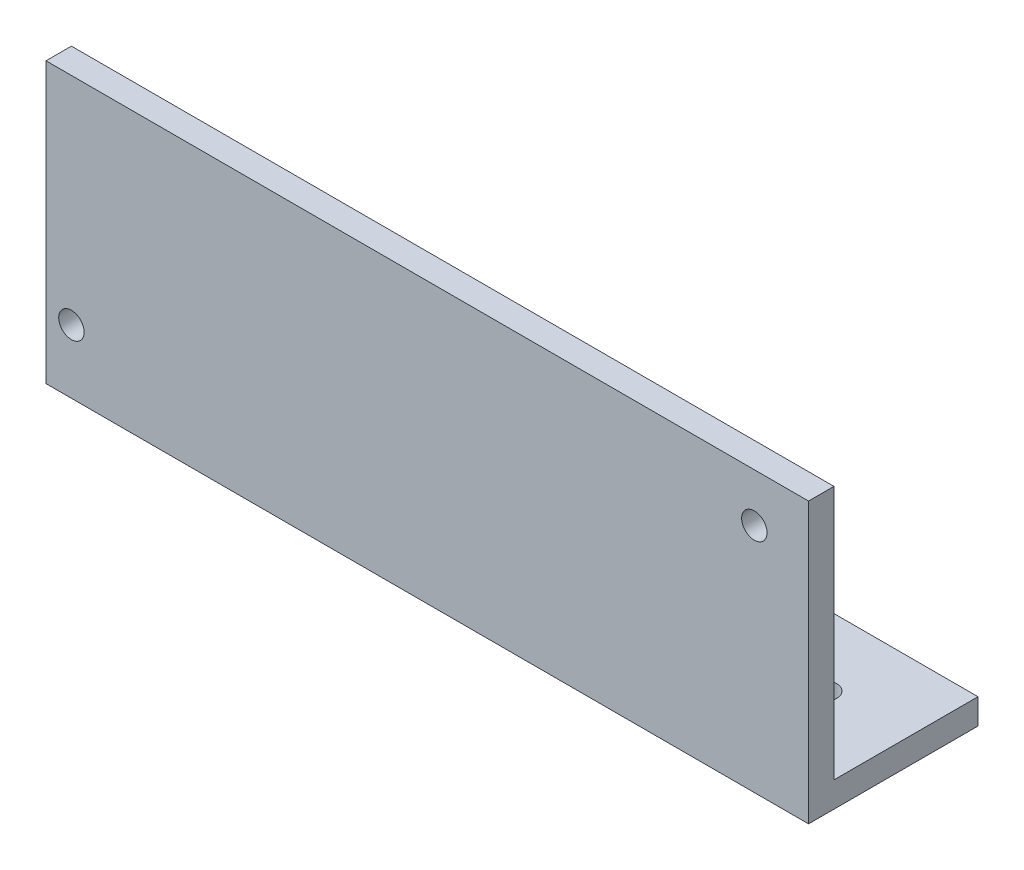
ISO-10303-21;
HEADER;
FILE_DESCRIPTION(('STEP AP214'),'2;1');
FILE_NAME('part.step','',(''),(''),'','','');
FILE_SCHEMA(('AUTOMOTIVE_DESIGN { 1 0 10303 214 1 1 1 1 }'));
ENDSEC;
DATA;
#1=APPLICATION_CONTEXT('core data for automotive mechanical design processes');
#2=APPLICATION_PROTOCOL_DEFINITION('international standard','automotive_design',2000,#1);
#3=PRODUCT_CONTEXT('',#1,'mechanical');
#4=PRODUCT('Part','Part','',(#3));
#5=PRODUCT_RELATED_PRODUCT_CATEGORY('part','',(#4));
#6=PRODUCT_DEFINITION_FORMATION('','',#4);
#7=PRODUCT_DEFINITION_CONTEXT('part definition',#1,'design');
#8=PRODUCT_DEFINITION('design','',#6,#7);
#9=PRODUCT_DEFINITION_SHAPE('','',#8);
#10=(LENGTH_UNIT() NAMED_UNIT(*) SI_UNIT(.MILLI.,.METRE.));
#11=(NAMED_UNIT(*) PLANE_ANGLE_UNIT() SI_UNIT($,.RADIAN.));
#12=(NAMED_UNIT(*) SI_UNIT($,.STERADIAN.) SOLID_ANGLE_UNIT());
#13=UNCERTAINTY_MEASURE_WITH_UNIT(LENGTH_MEASURE(1.E-05),#10,'distance_accuracy_value','');
#14=(GEOMETRIC_REPRESENTATION_CONTEXT(3) GLOBAL_UNCERTAINTY_ASSIGNED_CONTEXT((#13)) GLOBAL_UNIT_ASSIGNED_CONTEXT((#10,
#11,#12)) REPRESENTATION_CONTEXT('',''));
#15=CARTESIAN_POINT('',(0.,0.,0.));
#16=DIRECTION('',(0.,0.,1.));
#17=DIRECTION('',(1.,0.,0.));
#18=AXIS2_PLACEMENT_3D('',#15,#16,#17);
#19=CARTESIAN_POINT('',(0.,3.,0.));
#20=DIRECTION('',(0.,-1.,0.));
#21=DIRECTION('',(0.,0.,-1.));
#22=AXIS2_PLACEMENT_3D('',#19,#20,#21);
#23=PLANE('',#22);
#24=DIRECTION('',(0.,0.,1.));
#25=VECTOR('',#24,1.);
#26=CARTESIAN_POINT('',(-13.8565022421524,3.,7.48878923766819));
#27=LINE('',#26,#25);
#28=CARTESIAN_POINT('',(-13.8565022421524,3.,-12.5112107623318));
#29=VERTEX_POINT('',#28);
#30=CARTESIAN_POINT('',(-13.8565022421524,3.,4.48878923766819));
#31=VERTEX_POINT('',#30);
#32=EDGE_CURVE('E97',#29,#31,#27,.T.);
#33=ORIENTED_EDGE('',*,*,#32,.T.);
#34=DIRECTION('',(1.,0.,0.));
#35=VECTOR('',#34,1.);
#36=CARTESIAN_POINT('',(-13.8565022421524,3.,4.48878923766819));
#37=LINE('',#36,#35);
#38=CARTESIAN_POINT('',(76.1434977578476,3.,4.48878923766819));
#39=VERTEX_POINT('',#38);
#40=EDGE_CURVE('E149',#31,#39,#37,.T.);
#41=ORIENTED_EDGE('',*,*,#40,.T.);
#42=DIRECTION('',(0.,0.,-1.));
#43=VECTOR('',#42,1.);
#44=CARTESIAN_POINT('',(76.1434977578476,3.,7.48878923766819));
#45=LINE('',#44,#43);
#46=CARTESIAN_POINT('',(76.1434977578476,3.,-12.5112107623318));
#47=VERTEX_POINT('',#46);
#48=EDGE_CURVE('E162',#39,#47,#45,.T.);
#49=ORIENTED_EDGE('',*,*,#48,.T.);
#50=DIRECTION('',(-1.,0.,0.));
#51=VECTOR('',#50,1.);
#52=CARTESIAN_POINT('',(-13.8565022421524,3.,-12.5112107623318));
#53=LINE('',#52,#51);
#54=EDGE_CURVE('E67',#47,#29,#53,.T.);
#55=ORIENTED_EDGE('',*,*,#54,.T.);
#56=EDGE_LOOP('',(#33,#41,#49,#55));
#57=FACE_BOUND('',#56,.T.);
#58=CARTESIAN_POINT('',(-6.33808931746725,3.,-4.01121076233181));
#59=DIRECTION('',(0.,1.,0.));
#60=DIRECTION('',(0.,0.,1.));
#61=AXIS2_PLACEMENT_3D('',#58,#59,#60);
#62=CIRCLE('',#61,1.5);
#63=CARTESIAN_POINT('',(-6.33808931746725,3.,-2.51121076233181));
#64=VERTEX_POINT('',#63);
#65=EDGE_CURVE('E111',#64,#64,#62,.T.);
#66=ORIENTED_EDGE('',*,*,#65,.F.);
#67=EDGE_LOOP('',(#66));
#68=FACE_BOUND('',#67,.T.);
#69=CARTESIAN_POINT('',(66.4709706334316,3.,-4.01121076233181));
#70=DIRECTION('',(0.,1.,0.));
#71=DIRECTION('',(0.,0.,1.));
#72=AXIS2_PLACEMENT_3D('',#69,#70,#71);
#73=CIRCLE('',#72,1.5);
#74=CARTESIAN_POINT('',(66.4709706334316,3.,-2.51121076233181));
#75=VERTEX_POINT('',#74);
#76=EDGE_CURVE('E168',#75,#75,#73,.T.);
#77=ORIENTED_EDGE('',*,*,#76,.F.);
#78=EDGE_LOOP('',(#77));
#79=FACE_BOUND('',#78,.T.);
#80=ADVANCED_FACE('F42',(#57,#68,#79),#23,.F.);
#81=CARTESIAN_POINT('',(0.,0.,0.));
#82=DIRECTION('',(0.,-1.,0.));
#83=DIRECTION('',(0.,0.,-1.));
#84=AXIS2_PLACEMENT_3D('',#81,#82,#83);
#85=PLANE('',#84);
#86=CARTESIAN_POINT('',(-6.33808931746725,0.,-4.01121076233181));
#87=DIRECTION('',(0.,1.,0.));
#88=DIRECTION('',(0.,0.,1.));
#89=AXIS2_PLACEMENT_3D('',#86,#87,#88);
#90=CIRCLE('',#89,1.5);
#91=CARTESIAN_POINT('',(-6.33808931746725,0.,-2.51121076233181));
#92=VERTEX_POINT('',#91);
#93=EDGE_CURVE('E117',#92,#92,#90,.T.);
#94=ORIENTED_EDGE('',*,*,#93,.T.);
#95=EDGE_LOOP('',(#94));
#96=FACE_BOUND('',#95,.T.);
#97=DIRECTION('',(0.,0.,1.));
#98=VECTOR('',#97,1.);
#99=CARTESIAN_POINT('',(-13.8565022421524,0.,7.48878923766819));
#100=LINE('',#99,#98);
#101=CARTESIAN_POINT('',(-13.8565022421524,0.,-12.5112107623318));
#102=VERTEX_POINT('',#101);
#103=CARTESIAN_POINT('',(-13.8565022421524,0.,7.48878923766819));
#104=VERTEX_POINT('',#103);
#105=EDGE_CURVE('E103',#102,#104,#100,.T.);
#106=ORIENTED_EDGE('',*,*,#105,.F.);
#107=DIRECTION('',(-1.,0.,0.));
#108=VECTOR('',#107,1.);
#109=CARTESIAN_POINT('',(-13.8565022421524,0.,-12.5112107623318));
#110=LINE('',#109,#108);
#111=CARTESIAN_POINT('',(76.1434977578476,0.,-12.5112107623318));
#112=VERTEX_POINT('',#111);
#113=EDGE_CURVE('E86',#112,#102,#110,.T.);
#114=ORIENTED_EDGE('',*,*,#113,.F.);
#115=DIRECTION('',(0.,0.,-1.));
#116=VECTOR('',#115,1.);
#117=CARTESIAN_POINT('',(76.1434977578476,0.,7.48878923766819));
#118=LINE('',#117,#116);
#119=CARTESIAN_POINT('',(76.1434977578476,0.,7.48878923766819));
#120=VERTEX_POINT('',#119);
#121=EDGE_CURVE('E98',#120,#112,#118,.T.);
#122=ORIENTED_EDGE('',*,*,#121,.F.);
#123=DIRECTION('',(1.,0.,0.));
#124=VECTOR('',#123,1.);
#125=CARTESIAN_POINT('',(-13.8565022421524,0.,7.48878923766819));
#126=LINE('',#125,#124);
#127=EDGE_CURVE('E109',#104,#120,#126,.T.);
#128=ORIENTED_EDGE('',*,*,#127,.F.);
#129=EDGE_LOOP('',(#106,#114,#122,#128));
#130=FACE_BOUND('',#129,.T.);
#131=CARTESIAN_POINT('',(66.4709706334316,0.,-4.01121076233181));
#132=DIRECTION('',(0.,1.,0.));
#133=DIRECTION('',(0.,0.,1.));
#134=AXIS2_PLACEMENT_3D('',#131,#132,#133);
#135=CIRCLE('',#134,1.5);
#136=CARTESIAN_POINT('',(66.4709706334316,0.,-2.51121076233181));
#137=VERTEX_POINT('',#136);
#138=EDGE_CURVE('E170',#137,#137,#135,.T.);
#139=ORIENTED_EDGE('',*,*,#138,.T.);
#140=EDGE_LOOP('',(#139));
#141=FACE_BOUND('',#140,.T.);
#142=ADVANCED_FACE('F107',(#96,#130,#141),#85,.T.);
#143=CARTESIAN_POINT('',(-13.8565022421524,3.,7.48878923766819));
#144=DIRECTION('',(1.,0.,0.));
#145=DIRECTION('',(0.,0.,-1.));
#146=AXIS2_PLACEMENT_3D('',#143,#144,#145);
#147=PLANE('',#146);
#148=ORIENTED_EDGE('',*,*,#105,.T.);
#149=DIRECTION('',(0.,-1.,0.));
#150=VECTOR('',#149,1.);
#151=CARTESIAN_POINT('',(-13.8565022421524,3.,7.48878923766819));
#152=LINE('',#151,#150);
#153=CARTESIAN_POINT('',(-13.8565022421524,33.,7.48878923766819));
#154=VERTEX_POINT('',#153);
#155=EDGE_CURVE('E11',#154,#104,#152,.T.);
#156=ORIENTED_EDGE('',*,*,#155,.F.);
#157=DIRECTION('',(0.,0.,1.));
#158=VECTOR('',#157,1.);
#159=CARTESIAN_POINT('',(-13.8565022421524,33.,4.48878923766819));
#160=LINE('',#159,#158);
#161=CARTESIAN_POINT('',(-13.8565022421524,33.,4.48878923766819));
#162=VERTEX_POINT('',#161);
#163=EDGE_CURVE('E157',#162,#154,#160,.T.);
#164=ORIENTED_EDGE('',*,*,#163,.F.);
#165=DIRECTION('',(0.,-1.,0.));
#166=VECTOR('',#165,1.);
#167=CARTESIAN_POINT('',(-13.8565022421524,3.,4.48878923766819));
#168=LINE('',#167,#166);
#169=EDGE_CURVE('E151',#162,#31,#168,.T.);
#170=ORIENTED_EDGE('',*,*,#169,.T.);
#171=ORIENTED_EDGE('',*,*,#32,.F.);
#172=DIRECTION('',(0.,-1.,0.));
#173=VECTOR('',#172,1.);
#174=CARTESIAN_POINT('',(-13.8565022421524,3.,-12.5112107623318));
#175=LINE('',#174,#173);
#176=EDGE_CURVE('E89',#29,#102,#175,.T.);
#177=ORIENTED_EDGE('',*,*,#176,.T.);
#178=EDGE_LOOP('',(#148,#156,#164,#170,#171,#177));
#179=FACE_BOUND('',#178,.T.);
#180=ADVANCED_FACE('F44',(#179),#147,.F.);
#181=CARTESIAN_POINT('',(-13.8565022421524,3.,7.48878923766819));
#182=DIRECTION('',(0.,0.,-1.));
#183=DIRECTION('',(-1.,0.,0.));
#184=AXIS2_PLACEMENT_3D('',#181,#182,#183);
#185=PLANE('',#184);
#186=ORIENTED_EDGE('',*,*,#127,.T.);
#187=DIRECTION('',(0.,-1.,0.));
#188=VECTOR('',#187,1.);
#189=CARTESIAN_POINT('',(76.1434977578476,3.,7.48878923766819));
#190=LINE('',#189,#188);
#191=CARTESIAN_POINT('',(76.1434977578476,33.,7.48878923766819));
#192=VERTEX_POINT('',#191);
#193=EDGE_CURVE('E51',#192,#120,#190,.T.);
#194=ORIENTED_EDGE('',*,*,#193,.F.);
#195=DIRECTION('',(-1.,0.,0.));
#196=VECTOR('',#195,1.);
#197=CARTESIAN_POINT('',(-13.8565022421524,33.,7.48878923766819));
#198=LINE('',#197,#196);
#199=EDGE_CURVE('E140',#192,#154,#198,.T.);
#200=ORIENTED_EDGE('',*,*,#199,.T.);
#201=ORIENTED_EDGE('',*,*,#155,.T.);
#202=EDGE_LOOP('',(#186,#194,#200,#201));
#203=FACE_BOUND('',#202,.T.);
#204=CARTESIAN_POINT('',(69.7434977578475,27.3,7.48878923766819));
#205=DIRECTION('',(0.,0.,1.));
#206=DIRECTION('',(1.,0.,0.));
#207=AXIS2_PLACEMENT_3D('',#204,#205,#206);
#208=CIRCLE('',#207,1.5);
#209=CARTESIAN_POINT('',(71.2434977578475,27.3,7.48878923766819));
#210=VERTEX_POINT('',#209);
#211=EDGE_CURVE('E197',#210,#210,#208,.T.);
#212=ORIENTED_EDGE('',*,*,#211,.F.);
#213=EDGE_LOOP('',(#212));
#214=FACE_BOUND('',#213,.T.);
#215=CARTESIAN_POINT('',(-10.8565022421524,7.5,7.48878923766819));
#216=DIRECTION('',(0.,0.,1.));
#217=DIRECTION('',(1.,0.,0.));
#218=AXIS2_PLACEMENT_3D('',#215,#216,#217);
#219=CIRCLE('',#218,1.5);
#220=CARTESIAN_POINT('',(-9.35650224215245,7.5,7.48878923766819));
#221=VERTEX_POINT('',#220);
#222=EDGE_CURVE('E189',#221,#221,#219,.T.);
#223=ORIENTED_EDGE('',*,*,#222,.F.);
#224=EDGE_LOOP('',(#223));
#225=FACE_BOUND('',#224,.T.);
#226=ADVANCED_FACE('F137',(#203,#214,#225),#185,.F.);
#227=CARTESIAN_POINT('',(76.1434977578476,3.,7.48878923766819));
#228=DIRECTION('',(-1.,0.,0.));
#229=DIRECTION('',(0.,0.,1.));
#230=AXIS2_PLACEMENT_3D('',#227,#228,#229);
#231=PLANE('',#230);
#232=ORIENTED_EDGE('',*,*,#121,.T.);
#233=DIRECTION('',(0.,-1.,0.));
#234=VECTOR('',#233,1.);
#235=CARTESIAN_POINT('',(76.1434977578476,3.,-12.5112107623318));
#236=LINE('',#235,#234);
#237=EDGE_CURVE('E92',#47,#112,#236,.T.);
#238=ORIENTED_EDGE('',*,*,#237,.F.);
#239=ORIENTED_EDGE('',*,*,#48,.F.);
#240=DIRECTION('',(0.,1.,0.));
#241=VECTOR('',#240,1.);
#242=CARTESIAN_POINT('',(76.1434977578476,3.,4.48878923766819));
#243=LINE('',#242,#241);
#244=CARTESIAN_POINT('',(76.1434977578476,33.,4.48878923766819));
#245=VERTEX_POINT('',#244);
#246=EDGE_CURVE('E58',#39,#245,#243,.T.);
#247=ORIENTED_EDGE('',*,*,#246,.T.);
#248=DIRECTION('',(0.,0.,1.));
#249=VECTOR('',#248,1.);
#250=CARTESIAN_POINT('',(76.1434977578476,33.,4.48878923766819));
#251=LINE('',#250,#249);
#252=EDGE_CURVE('E133',#245,#192,#251,.T.);
#253=ORIENTED_EDGE('',*,*,#252,.T.);
#254=ORIENTED_EDGE('',*,*,#193,.T.);
#255=EDGE_LOOP('',(#232,#238,#239,#247,#253,#254));
#256=FACE_BOUND('',#255,.T.);
#257=ADVANCED_FACE('F130',(#256),#231,.F.);
#258=CARTESIAN_POINT('',(-13.8565022421524,3.,-12.5112107623318));
#259=DIRECTION('',(0.,0.,1.));
#260=DIRECTION('',(1.,0.,0.));
#261=AXIS2_PLACEMENT_3D('',#258,#259,#260);
#262=PLANE('',#261);
#263=ORIENTED_EDGE('',*,*,#113,.T.);
#264=ORIENTED_EDGE('',*,*,#176,.F.);
#265=ORIENTED_EDGE('',*,*,#54,.F.);
#266=ORIENTED_EDGE('',*,*,#237,.T.);
#267=EDGE_LOOP('',(#263,#264,#265,#266));
#268=FACE_BOUND('',#267,.T.);
#269=ADVANCED_FACE('F88',(#268),#262,.F.);
#270=CARTESIAN_POINT('',(-6.33808931746725,3.,-4.01121076233181));
#271=DIRECTION('',(0.,-1.,0.));
#272=DIRECTION('',(0.,0.,-1.));
#273=AXIS2_PLACEMENT_3D('',#270,#271,#272);
#274=CYLINDRICAL_SURFACE('',#273,1.5);
#275=ORIENTED_EDGE('',*,*,#65,.T.);
#276=EDGE_LOOP('',(#275));
#277=FACE_BOUND('',#276,.T.);
#278=ORIENTED_EDGE('',*,*,#93,.F.);
#279=EDGE_LOOP('',(#278));
#280=FACE_BOUND('',#279,.T.);
#281=ADVANCED_FACE('F234',(#277,#280),#274,.F.);
#282=CARTESIAN_POINT('',(66.4709706334316,3.,-4.01121076233181));
#283=DIRECTION('',(0.,-1.,0.));
#284=DIRECTION('',(0.,0.,-1.));
#285=AXIS2_PLACEMENT_3D('',#282,#283,#284);
#286=CYLINDRICAL_SURFACE('',#285,1.5);
#287=ORIENTED_EDGE('',*,*,#76,.T.);
#288=EDGE_LOOP('',(#287));
#289=FACE_BOUND('',#288,.T.);
#290=ORIENTED_EDGE('',*,*,#138,.F.);
#291=EDGE_LOOP('',(#290));
#292=FACE_BOUND('',#291,.T.);
#293=ADVANCED_FACE('F257',(#289,#292),#286,.F.);
#294=CARTESIAN_POINT('',(-13.8565022421524,33.,4.48878923766819));
#295=DIRECTION('',(0.,1.,0.));
#296=DIRECTION('',(0.,0.,1.));
#297=AXIS2_PLACEMENT_3D('',#294,#295,#296);
#298=PLANE('',#297);
#299=ORIENTED_EDGE('',*,*,#199,.F.);
#300=ORIENTED_EDGE('',*,*,#252,.F.);
#301=DIRECTION('',(-1.,0.,0.));
#302=VECTOR('',#301,1.);
#303=CARTESIAN_POINT('',(-13.8565022421524,33.,4.48878923766819));
#304=LINE('',#303,#302);
#305=EDGE_CURVE('E179',#245,#162,#304,.T.);
#306=ORIENTED_EDGE('',*,*,#305,.T.);
#307=ORIENTED_EDGE('',*,*,#163,.T.);
#308=EDGE_LOOP('',(#299,#300,#306,#307));
#309=FACE_BOUND('',#308,.T.);
#310=ADVANCED_FACE('F223',(#309),#298,.T.);
#311=CARTESIAN_POINT('',(0.,0.,4.48878923766819));
#312=DIRECTION('',(0.,0.,-1.));
#313=DIRECTION('',(-1.,0.,0.));
#314=AXIS2_PLACEMENT_3D('',#311,#312,#313);
#315=PLANE('',#314);
#316=CARTESIAN_POINT('',(69.7434977578475,27.3,4.48878923766819));
#317=DIRECTION('',(0.,0.,1.));
#318=DIRECTION('',(1.,0.,0.));
#319=AXIS2_PLACEMENT_3D('',#316,#317,#318);
#320=CIRCLE('',#319,1.5);
#321=CARTESIAN_POINT('',(71.2434977578475,27.3,4.48878923766819));
#322=VERTEX_POINT('',#321);
#323=EDGE_CURVE('E193',#322,#322,#320,.T.);
#324=ORIENTED_EDGE('',*,*,#323,.T.);
#325=EDGE_LOOP('',(#324));
#326=FACE_BOUND('',#325,.T.);
#327=CARTESIAN_POINT('',(-10.8565022421524,7.5,4.48878923766819));
#328=DIRECTION('',(0.,0.,1.));
#329=DIRECTION('',(1.,0.,0.));
#330=AXIS2_PLACEMENT_3D('',#327,#328,#329);
#331=CIRCLE('',#330,1.5);
#332=CARTESIAN_POINT('',(-9.35650224215245,7.5,4.48878923766819));
#333=VERTEX_POINT('',#332);
#334=EDGE_CURVE('E184',#333,#333,#331,.T.);
#335=ORIENTED_EDGE('',*,*,#334,.T.);
#336=EDGE_LOOP('',(#335));
#337=FACE_BOUND('',#336,.T.);
#338=ORIENTED_EDGE('',*,*,#169,.F.);
#339=ORIENTED_EDGE('',*,*,#305,.F.);
#340=ORIENTED_EDGE('',*,*,#246,.F.);
#341=ORIENTED_EDGE('',*,*,#40,.F.);
#342=EDGE_LOOP('',(#338,#339,#340,#341));
#343=FACE_BOUND('',#342,.T.);
#344=ADVANCED_FACE('F150',(#326,#337,#343),#315,.T.);
#345=CARTESIAN_POINT('',(-10.8565022421524,7.5,4.48878923766819));
#346=DIRECTION('',(0.,0.,1.));
#347=DIRECTION('',(1.,0.,0.));
#348=AXIS2_PLACEMENT_3D('',#345,#346,#347);
#349=CYLINDRICAL_SURFACE('',#348,1.5);
#350=ORIENTED_EDGE('',*,*,#334,.F.);
#351=EDGE_LOOP('',(#350));
#352=FACE_BOUND('',#351,.T.);
#353=ORIENTED_EDGE('',*,*,#222,.T.);
#354=EDGE_LOOP('',(#353));
#355=FACE_BOUND('',#354,.T.);
#356=ADVANCED_FACE('F210',(#352,#355),#349,.F.);
#357=CARTESIAN_POINT('',(69.7434977578475,27.3,4.48878923766819));
#358=DIRECTION('',(0.,0.,1.));
#359=DIRECTION('',(1.,0.,0.));
#360=AXIS2_PLACEMENT_3D('',#357,#358,#359);
#361=CYLINDRICAL_SURFACE('',#360,1.5);
#362=ORIENTED_EDGE('',*,*,#323,.F.);
#363=EDGE_LOOP('',(#362));
#364=FACE_BOUND('',#363,.T.);
#365=ORIENTED_EDGE('',*,*,#211,.T.);
#366=EDGE_LOOP('',(#365));
#367=FACE_BOUND('',#366,.T.);
#368=ADVANCED_FACE('F207',(#364,#367),#361,.F.);
#369=CLOSED_SHELL('',(#80,#142,#180,#226,#257,#269,#281,#293,#310,#344,#356,#368));
#370=MANIFOLD_SOLID_BREP('B2',#369);
#371=ADVANCED_BREP_SHAPE_REPRESENTATION('',(#18,#370),#14);
#372=SHAPE_DEFINITION_REPRESENTATION(#9,#371);
ENDSEC;
END-ISO-10303-21;
